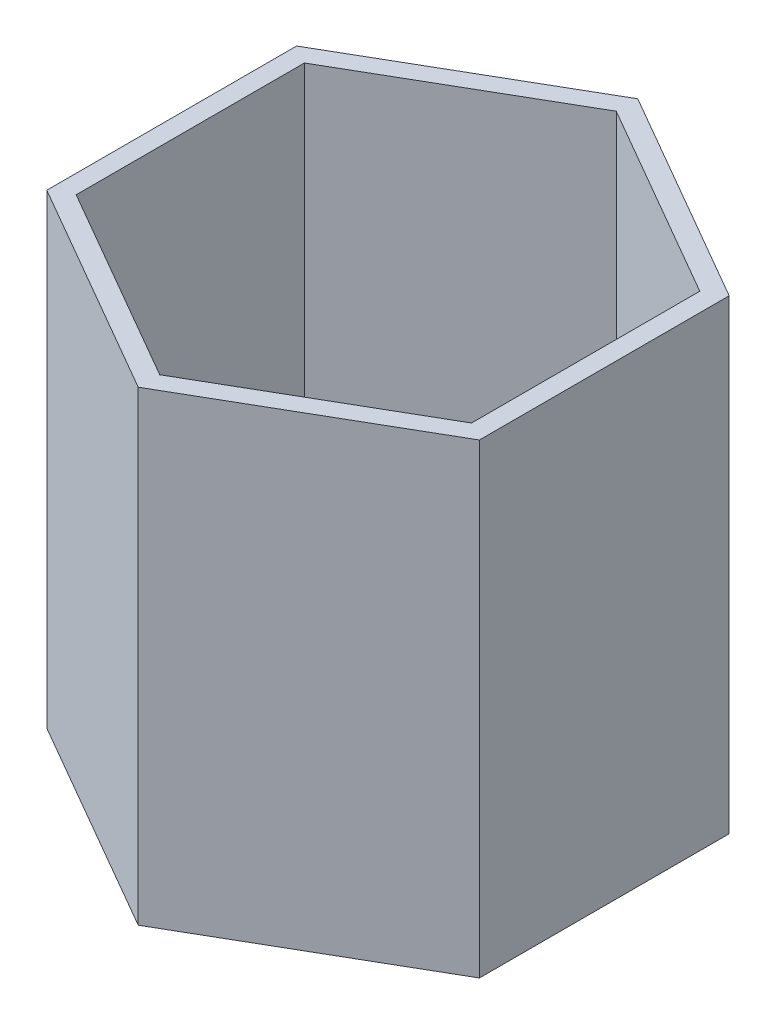
ISO-10303-21;
HEADER;
FILE_DESCRIPTION(('STEP AP214'),'2;1');
FILE_NAME('part.step','',(''),(''),'','','');
FILE_SCHEMA(('AUTOMOTIVE_DESIGN { 1 0 10303 214 1 1 1 1 }'));
ENDSEC;
DATA;
#1=APPLICATION_CONTEXT('core data for automotive mechanical design processes');
#2=APPLICATION_PROTOCOL_DEFINITION('international standard','automotive_design',2000,#1);
#3=PRODUCT_CONTEXT('',#1,'mechanical');
#4=PRODUCT('Part','Part','',(#3));
#5=PRODUCT_RELATED_PRODUCT_CATEGORY('part','',(#4));
#6=PRODUCT_DEFINITION_FORMATION('','',#4);
#7=PRODUCT_DEFINITION_CONTEXT('part definition',#1,'design');
#8=PRODUCT_DEFINITION('design','',#6,#7);
#9=PRODUCT_DEFINITION_SHAPE('','',#8);
#10=(LENGTH_UNIT() NAMED_UNIT(*) SI_UNIT(.MILLI.,.METRE.));
#11=(NAMED_UNIT(*) PLANE_ANGLE_UNIT() SI_UNIT($,.RADIAN.));
#12=(NAMED_UNIT(*) SI_UNIT($,.STERADIAN.) SOLID_ANGLE_UNIT());
#13=UNCERTAINTY_MEASURE_WITH_UNIT(LENGTH_MEASURE(1.E-05),#10,'distance_accuracy_value','');
#14=(GEOMETRIC_REPRESENTATION_CONTEXT(3) GLOBAL_UNCERTAINTY_ASSIGNED_CONTEXT((#13)) GLOBAL_UNIT_ASSIGNED_CONTEXT((#10,
#11,#12)) REPRESENTATION_CONTEXT('',''));
#15=CARTESIAN_POINT('',(0.,0.,0.));
#16=DIRECTION('',(0.,0.,1.));
#17=DIRECTION('',(1.,0.,0.));
#18=AXIS2_PLACEMENT_3D('',#15,#16,#17);
#19=CARTESIAN_POINT('',(23.2124666766494,3.,0.));
#20=DIRECTION('',(-1.,0.,0.));
#21=DIRECTION('',(0.,0.,1.));
#22=AXIS2_PLACEMENT_3D('',#19,#20,#21);
#23=PLANE('',#22);
#24=DIRECTION('',(0.,0.,-1.));
#25=VECTOR('',#24,1.);
#26=CARTESIAN_POINT('',(23.2124666766494,0.,0.));
#27=LINE('',#26,#25);
#28=CARTESIAN_POINT('',(23.2124666766494,0.,13.4017238843187));
#29=VERTEX_POINT('',#28);
#30=CARTESIAN_POINT('',(23.2124666766494,0.,-13.4017238843188));
#31=VERTEX_POINT('',#30);
#32=EDGE_CURVE('E200',#29,#31,#27,.T.);
#33=ORIENTED_EDGE('',*,*,#32,.T.);
#34=DIRECTION('',(0.,-1.,0.));
#35=VECTOR('',#34,1.);
#36=CARTESIAN_POINT('',(23.2124666766494,3.,-13.4017238843188));
#37=LINE('',#36,#35);
#38=CARTESIAN_POINT('',(23.2124666766494,50.,-13.4017238843188));
#39=VERTEX_POINT('',#38);
#40=EDGE_CURVE('E11',#39,#31,#37,.T.);
#41=ORIENTED_EDGE('',*,*,#40,.F.);
#42=DIRECTION('',(0.,0.,-1.));
#43=VECTOR('',#42,1.);
#44=CARTESIAN_POINT('',(23.2124666766494,50.,13.4017238843187));
#45=LINE('',#44,#43);
#46=CARTESIAN_POINT('',(23.2124666766494,50.,13.4017238843187));
#47=VERTEX_POINT('',#46);
#48=EDGE_CURVE('E184',#47,#39,#45,.T.);
#49=ORIENTED_EDGE('',*,*,#48,.F.);
#50=DIRECTION('',(0.,-1.,0.));
#51=VECTOR('',#50,1.);
#52=CARTESIAN_POINT('',(23.2124666766494,3.,13.4017238843187));
#53=LINE('',#52,#51);
#54=EDGE_CURVE('E213',#47,#29,#53,.T.);
#55=ORIENTED_EDGE('',*,*,#54,.T.);
#56=EDGE_LOOP('',(#33,#41,#49,#55));
#57=FACE_BOUND('',#56,.T.);
#58=ADVANCED_FACE('F40',(#57),#23,.F.);
#59=CARTESIAN_POINT('',(11.6062333383247,3.,-20.1025858264781));
#60=DIRECTION('',(-0.5,0.,0.866025403784439));
#61=DIRECTION('',(0.866025403784439,0.,0.5));
#62=AXIS2_PLACEMENT_3D('',#59,#60,#61);
#63=PLANE('',#62);
#64=DIRECTION('',(-0.866025403784439,0.,-0.5));
#65=VECTOR('',#64,1.);
#66=CARTESIAN_POINT('',(11.6062333383247,0.,-20.1025858264781));
#67=LINE('',#66,#65);
#68=CARTESIAN_POINT('',(0.,0.,-26.8034477686375));
#69=VERTEX_POINT('',#68);
#70=EDGE_CURVE('E203',#31,#69,#67,.T.);
#71=ORIENTED_EDGE('',*,*,#70,.T.);
#72=DIRECTION('',(0.,-1.,0.));
#73=VECTOR('',#72,1.);
#74=CARTESIAN_POINT('',(0.,3.,-26.8034477686375));
#75=LINE('',#74,#73);
#76=CARTESIAN_POINT('',(0.,50.,-26.8034477686375));
#77=VERTEX_POINT('',#76);
#78=EDGE_CURVE('E47',#77,#69,#75,.T.);
#79=ORIENTED_EDGE('',*,*,#78,.F.);
#80=DIRECTION('',(-0.866025403784439,0.,-0.5));
#81=VECTOR('',#80,1.);
#82=CARTESIAN_POINT('',(23.2124666766494,50.,-13.4017238843188));
#83=LINE('',#82,#81);
#84=EDGE_CURVE('E142',#39,#77,#83,.T.);
#85=ORIENTED_EDGE('',*,*,#84,.F.);
#86=ORIENTED_EDGE('',*,*,#40,.T.);
#87=EDGE_LOOP('',(#71,#79,#85,#86));
#88=FACE_BOUND('',#87,.T.);
#89=ADVANCED_FACE('F249',(#88),#63,.F.);
#90=CARTESIAN_POINT('',(-11.6062333383247,3.,-20.1025858264781));
#91=DIRECTION('',(0.5,0.,0.866025403784439));
#92=DIRECTION('',(0.866025403784439,0.,-0.5));
#93=AXIS2_PLACEMENT_3D('',#90,#91,#92);
#94=PLANE('',#93);
#95=DIRECTION('',(-0.866025403784439,0.,0.5));
#96=VECTOR('',#95,1.);
#97=CARTESIAN_POINT('',(-11.6062333383247,0.,-20.1025858264781));
#98=LINE('',#97,#96);
#99=CARTESIAN_POINT('',(-23.2124666766494,0.,-13.4017238843188));
#100=VERTEX_POINT('',#99);
#101=EDGE_CURVE('E205',#69,#100,#98,.T.);
#102=ORIENTED_EDGE('',*,*,#101,.T.);
#103=DIRECTION('',(0.,-1.,0.));
#104=VECTOR('',#103,1.);
#105=CARTESIAN_POINT('',(-23.2124666766494,3.,-13.4017238843188));
#106=LINE('',#105,#104);
#107=CARTESIAN_POINT('',(-23.2124666766494,50.,-13.4017238843188));
#108=VERTEX_POINT('',#107);
#109=EDGE_CURVE('E222',#108,#100,#106,.T.);
#110=ORIENTED_EDGE('',*,*,#109,.F.);
#111=DIRECTION('',(-0.866025403784438,0.,0.5));
#112=VECTOR('',#111,1.);
#113=CARTESIAN_POINT('',(0.,50.,-26.8034477686375));
#114=LINE('',#113,#112);
#115=EDGE_CURVE('E172',#77,#108,#114,.T.);
#116=ORIENTED_EDGE('',*,*,#115,.F.);
#117=ORIENTED_EDGE('',*,*,#78,.T.);
#118=EDGE_LOOP('',(#102,#110,#116,#117));
#119=FACE_BOUND('',#118,.T.);
#120=ADVANCED_FACE('F228',(#119),#94,.F.);
#121=CARTESIAN_POINT('',(-23.2124666766494,3.,0.));
#122=DIRECTION('',(1.,0.,0.));
#123=DIRECTION('',(0.,0.,-1.));
#124=AXIS2_PLACEMENT_3D('',#121,#122,#123);
#125=PLANE('',#124);
#126=DIRECTION('',(0.,0.,1.));
#127=VECTOR('',#126,1.);
#128=CARTESIAN_POINT('',(-23.2124666766494,0.,0.));
#129=LINE('',#128,#127);
#130=CARTESIAN_POINT('',(-23.2124666766494,0.,13.4017238843188));
#131=VERTEX_POINT('',#130);
#132=EDGE_CURVE('E207',#100,#131,#129,.T.);
#133=ORIENTED_EDGE('',*,*,#132,.T.);
#134=DIRECTION('',(0.,-1.,0.));
#135=VECTOR('',#134,1.);
#136=CARTESIAN_POINT('',(-23.2124666766494,3.,13.4017238843188));
#137=LINE('',#136,#135);
#138=CARTESIAN_POINT('',(-23.2124666766494,50.,13.4017238843188));
#139=VERTEX_POINT('',#138);
#140=EDGE_CURVE('E219',#139,#131,#137,.T.);
#141=ORIENTED_EDGE('',*,*,#140,.F.);
#142=DIRECTION('',(0.,0.,1.));
#143=VECTOR('',#142,1.);
#144=CARTESIAN_POINT('',(-23.2124666766494,50.,-13.4017238843188));
#145=LINE('',#144,#143);
#146=EDGE_CURVE('E175',#108,#139,#145,.T.);
#147=ORIENTED_EDGE('',*,*,#146,.F.);
#148=ORIENTED_EDGE('',*,*,#109,.T.);
#149=EDGE_LOOP('',(#133,#141,#147,#148));
#150=FACE_BOUND('',#149,.T.);
#151=ADVANCED_FACE('F238',(#150),#125,.F.);
#152=CARTESIAN_POINT('',(-11.6062333383247,3.,20.1025858264781));
#153=DIRECTION('',(0.5,0.,-0.866025403784439));
#154=DIRECTION('',(-0.866025403784439,0.,-0.5));
#155=AXIS2_PLACEMENT_3D('',#152,#153,#154);
#156=PLANE('',#155);
#157=DIRECTION('',(0.866025403784439,0.,0.5));
#158=VECTOR('',#157,1.);
#159=CARTESIAN_POINT('',(-11.6062333383247,0.,20.1025858264781));
#160=LINE('',#159,#158);
#161=CARTESIAN_POINT('',(0.,0.,26.8034477686375));
#162=VERTEX_POINT('',#161);
#163=EDGE_CURVE('E209',#131,#162,#160,.T.);
#164=ORIENTED_EDGE('',*,*,#163,.T.);
#165=DIRECTION('',(0.,-1.,0.));
#166=VECTOR('',#165,1.);
#167=CARTESIAN_POINT('',(0.,3.,26.8034477686375));
#168=LINE('',#167,#166);
#169=CARTESIAN_POINT('',(0.,50.,26.8034477686375));
#170=VERTEX_POINT('',#169);
#171=EDGE_CURVE('E216',#170,#162,#168,.T.);
#172=ORIENTED_EDGE('',*,*,#171,.F.);
#173=DIRECTION('',(0.866025403784439,0.,0.5));
#174=VECTOR('',#173,1.);
#175=CARTESIAN_POINT('',(-23.2124666766494,50.,13.4017238843188));
#176=LINE('',#175,#174);
#177=EDGE_CURVE('E178',#139,#170,#176,.T.);
#178=ORIENTED_EDGE('',*,*,#177,.F.);
#179=ORIENTED_EDGE('',*,*,#140,.T.);
#180=EDGE_LOOP('',(#164,#172,#178,#179));
#181=FACE_BOUND('',#180,.T.);
#182=ADVANCED_FACE('F242',(#181),#156,.F.);
#183=CARTESIAN_POINT('',(11.6062333383247,3.,20.1025858264781));
#184=DIRECTION('',(-0.5,0.,-0.866025403784438));
#185=DIRECTION('',(-0.866025403784439,0.,0.5));
#186=AXIS2_PLACEMENT_3D('',#183,#184,#185);
#187=PLANE('',#186);
#188=DIRECTION('',(0.866025403784439,0.,-0.5));
#189=VECTOR('',#188,1.);
#190=CARTESIAN_POINT('',(11.6062333383247,0.,20.1025858264781));
#191=LINE('',#190,#189);
#192=EDGE_CURVE('E211',#162,#29,#191,.T.);
#193=ORIENTED_EDGE('',*,*,#192,.T.);
#194=ORIENTED_EDGE('',*,*,#54,.F.);
#195=DIRECTION('',(0.866025403784438,0.,-0.5));
#196=VECTOR('',#195,1.);
#197=CARTESIAN_POINT('',(0.,50.,26.8034477686375));
#198=LINE('',#197,#196);
#199=EDGE_CURVE('E181',#170,#47,#198,.T.);
#200=ORIENTED_EDGE('',*,*,#199,.F.);
#201=ORIENTED_EDGE('',*,*,#171,.T.);
#202=EDGE_LOOP('',(#193,#194,#200,#201));
#203=FACE_BOUND('',#202,.T.);
#204=ADVANCED_FACE('F247',(#203),#187,.F.);
#205=CARTESIAN_POINT('',(0.,0.,0.));
#206=DIRECTION('',(0.,1.,0.));
#207=DIRECTION('',(0.,0.,1.));
#208=AXIS2_PLACEMENT_3D('',#205,#206,#207);
#209=PLANE('',#208);
#210=ORIENTED_EDGE('',*,*,#32,.F.);
#211=ORIENTED_EDGE('',*,*,#192,.F.);
#212=ORIENTED_EDGE('',*,*,#163,.F.);
#213=ORIENTED_EDGE('',*,*,#132,.F.);
#214=ORIENTED_EDGE('',*,*,#101,.F.);
#215=ORIENTED_EDGE('',*,*,#70,.F.);
#216=EDGE_LOOP('',(#210,#211,#212,#213,#214,#215));
#217=FACE_BOUND('',#216,.T.);
#218=ADVANCED_FACE('F234',(#217),#209,.F.);
#219=CARTESIAN_POINT('',(0.,50.,0.));
#220=DIRECTION('',(0.,1.,0.));
#221=DIRECTION('',(0.,0.,1.));
#222=AXIS2_PLACEMENT_3D('',#219,#220,#221);
#223=PLANE('',#222);
#224=ORIENTED_EDGE('',*,*,#84,.T.);
#225=ORIENTED_EDGE('',*,*,#115,.T.);
#226=ORIENTED_EDGE('',*,*,#146,.T.);
#227=ORIENTED_EDGE('',*,*,#177,.T.);
#228=ORIENTED_EDGE('',*,*,#199,.T.);
#229=ORIENTED_EDGE('',*,*,#48,.T.);
#230=EDGE_LOOP('',(#224,#225,#226,#227,#228,#229));
#231=FACE_BOUND('',#230,.T.);
#232=DIRECTION('',(-0.866025403784439,0.,-0.5));
#233=VECTOR('',#232,1.);
#234=CARTESIAN_POINT('',(21.2124666766494,50.,-12.2470233459395));
#235=LINE('',#234,#233);
#236=CARTESIAN_POINT('',(21.2124666766494,50.,-12.2470233459395));
#237=VERTEX_POINT('',#236);
#238=CARTESIAN_POINT('',(0.,50.,-24.494046691879));
#239=VERTEX_POINT('',#238);
#240=EDGE_CURVE('E136',#237,#239,#235,.T.);
#241=ORIENTED_EDGE('',*,*,#240,.F.);
#242=DIRECTION('',(0.,0.,-1.));
#243=VECTOR('',#242,1.);
#244=CARTESIAN_POINT('',(21.2124666766494,50.,12.2470233459395));
#245=LINE('',#244,#243);
#246=CARTESIAN_POINT('',(21.2124666766494,50.,12.2470233459395));
#247=VERTEX_POINT('',#246);
#248=EDGE_CURVE('E127',#247,#237,#245,.T.);
#249=ORIENTED_EDGE('',*,*,#248,.F.);
#250=DIRECTION('',(0.866025403784439,0.,-0.5));
#251=VECTOR('',#250,1.);
#252=CARTESIAN_POINT('',(0.,50.,24.494046691879));
#253=LINE('',#252,#251);
#254=CARTESIAN_POINT('',(0.,50.,24.494046691879));
#255=VERTEX_POINT('',#254);
#256=EDGE_CURVE('E157',#255,#247,#253,.T.);
#257=ORIENTED_EDGE('',*,*,#256,.F.);
#258=DIRECTION('',(0.866025403784439,0.,0.5));
#259=VECTOR('',#258,1.);
#260=CARTESIAN_POINT('',(-21.2124666766494,50.,12.2470233459395));
#261=LINE('',#260,#259);
#262=CARTESIAN_POINT('',(-21.2124666766494,50.,12.2470233459395));
#263=VERTEX_POINT('',#262);
#264=EDGE_CURVE('E154',#263,#255,#261,.T.);
#265=ORIENTED_EDGE('',*,*,#264,.F.);
#266=DIRECTION('',(0.,0.,1.));
#267=VECTOR('',#266,1.);
#268=CARTESIAN_POINT('',(-21.2124666766494,50.,-12.2470233459395));
#269=LINE('',#268,#267);
#270=CARTESIAN_POINT('',(-21.2124666766494,50.,-12.2470233459395));
#271=VERTEX_POINT('',#270);
#272=EDGE_CURVE('E150',#271,#263,#269,.T.);
#273=ORIENTED_EDGE('',*,*,#272,.F.);
#274=DIRECTION('',(-0.866025403784439,0.,0.5));
#275=VECTOR('',#274,1.);
#276=CARTESIAN_POINT('',(0.,50.,-24.494046691879));
#277=LINE('',#276,#275);
#278=EDGE_CURVE('E148',#239,#271,#277,.T.);
#279=ORIENTED_EDGE('',*,*,#278,.F.);
#280=EDGE_LOOP('',(#241,#249,#257,#265,#273,#279));
#281=FACE_BOUND('',#280,.T.);
#282=ADVANCED_FACE('F146',(#231,#281),#223,.T.);
#283=CARTESIAN_POINT('',(21.2124666766494,50.,12.2470233459395));
#284=DIRECTION('',(-1.,0.,0.));
#285=DIRECTION('',(0.,0.,1.));
#286=AXIS2_PLACEMENT_3D('',#283,#284,#285);
#287=PLANE('',#286);
#288=DIRECTION('',(0.,-1.,0.));
#289=VECTOR('',#288,1.);
#290=CARTESIAN_POINT('',(21.2124666766494,50.,-12.2470233459395));
#291=LINE('',#290,#289);
#292=CARTESIAN_POINT('',(21.2124666766494,3.,-12.2470233459395));
#293=VERTEX_POINT('',#292);
#294=EDGE_CURVE('E130',#237,#293,#291,.T.);
#295=ORIENTED_EDGE('',*,*,#294,.T.);
#296=DIRECTION('',(0.,0.,1.));
#297=VECTOR('',#296,1.);
#298=CARTESIAN_POINT('',(21.2124666766494,3.,0.));
#299=LINE('',#298,#297);
#300=CARTESIAN_POINT('',(21.2124666766494,3.,12.2470233459395));
#301=VERTEX_POINT('',#300);
#302=EDGE_CURVE('E54',#293,#301,#299,.T.);
#303=ORIENTED_EDGE('',*,*,#302,.T.);
#304=DIRECTION('',(0.,-1.,0.));
#305=VECTOR('',#304,1.);
#306=CARTESIAN_POINT('',(21.2124666766494,50.,12.2470233459395));
#307=LINE('',#306,#305);
#308=EDGE_CURVE('E132',#247,#301,#307,.T.);
#309=ORIENTED_EDGE('',*,*,#308,.F.);
#310=ORIENTED_EDGE('',*,*,#248,.T.);
#311=EDGE_LOOP('',(#295,#303,#309,#310));
#312=FACE_BOUND('',#311,.T.);
#313=ADVANCED_FACE('F129',(#312),#287,.T.);
#314=CARTESIAN_POINT('',(21.2124666766494,50.,-12.2470233459395));
#315=DIRECTION('',(-0.5,0.,0.866025403784439));
#316=DIRECTION('',(0.866025403784439,0.,0.5));
#317=AXIS2_PLACEMENT_3D('',#314,#315,#316);
#318=PLANE('',#317);
#319=DIRECTION('',(0.,-1.,0.));
#320=VECTOR('',#319,1.);
#321=CARTESIAN_POINT('',(0.,50.,-24.494046691879));
#322=LINE('',#321,#320);
#323=CARTESIAN_POINT('',(0.,3.,-24.494046691879));
#324=VERTEX_POINT('',#323);
#325=EDGE_CURVE('E143',#239,#324,#322,.T.);
#326=ORIENTED_EDGE('',*,*,#325,.T.);
#327=DIRECTION('',(0.866025403784439,0.,0.5));
#328=VECTOR('',#327,1.);
#329=CARTESIAN_POINT('',(10.6062333383247,3.,-18.3705350189093));
#330=LINE('',#329,#328);
#331=EDGE_CURVE('E58',#324,#293,#330,.T.);
#332=ORIENTED_EDGE('',*,*,#331,.T.);
#333=ORIENTED_EDGE('',*,*,#294,.F.);
#334=ORIENTED_EDGE('',*,*,#240,.T.);
#335=EDGE_LOOP('',(#326,#332,#333,#334));
#336=FACE_BOUND('',#335,.T.);
#337=ADVANCED_FACE('F140',(#336),#318,.T.);
#338=CARTESIAN_POINT('',(0.,50.,-24.494046691879));
#339=DIRECTION('',(0.5,0.,0.866025403784438));
#340=DIRECTION('',(0.866025403784438,0.,-0.5));
#341=AXIS2_PLACEMENT_3D('',#338,#339,#340);
#342=PLANE('',#341);
#343=DIRECTION('',(0.,-1.,0.));
#344=VECTOR('',#343,1.);
#345=CARTESIAN_POINT('',(-21.2124666766494,50.,-12.2470233459395));
#346=LINE('',#345,#344);
#347=CARTESIAN_POINT('',(-21.2124666766494,3.,-12.2470233459395));
#348=VERTEX_POINT('',#347);
#349=EDGE_CURVE('E166',#271,#348,#346,.T.);
#350=ORIENTED_EDGE('',*,*,#349,.T.);
#351=DIRECTION('',(0.866025403784438,0.,-0.5));
#352=VECTOR('',#351,1.);
#353=CARTESIAN_POINT('',(-10.6062333383247,3.,-18.3705350189092));
#354=LINE('',#353,#352);
#355=EDGE_CURVE('E196',#348,#324,#354,.T.);
#356=ORIENTED_EDGE('',*,*,#355,.T.);
#357=ORIENTED_EDGE('',*,*,#325,.F.);
#358=ORIENTED_EDGE('',*,*,#278,.T.);
#359=EDGE_LOOP('',(#350,#356,#357,#358));
#360=FACE_BOUND('',#359,.T.);
#361=ADVANCED_FACE('F275',(#360),#342,.T.);
#362=CARTESIAN_POINT('',(-21.2124666766494,50.,-12.2470233459395));
#363=DIRECTION('',(1.,0.,0.));
#364=DIRECTION('',(0.,0.,-1.));
#365=AXIS2_PLACEMENT_3D('',#362,#363,#364);
#366=PLANE('',#365);
#367=DIRECTION('',(0.,-1.,0.));
#368=VECTOR('',#367,1.);
#369=CARTESIAN_POINT('',(-21.2124666766494,50.,12.2470233459395));
#370=LINE('',#369,#368);
#371=CARTESIAN_POINT('',(-21.2124666766494,3.,12.2470233459395));
#372=VERTEX_POINT('',#371);
#373=EDGE_CURVE('E163',#263,#372,#370,.T.);
#374=ORIENTED_EDGE('',*,*,#373,.T.);
#375=DIRECTION('',(0.,0.,-1.));
#376=VECTOR('',#375,1.);
#377=CARTESIAN_POINT('',(-21.2124666766494,3.,0.));
#378=LINE('',#377,#376);
#379=EDGE_CURVE('E193',#372,#348,#378,.T.);
#380=ORIENTED_EDGE('',*,*,#379,.T.);
#381=ORIENTED_EDGE('',*,*,#349,.F.);
#382=ORIENTED_EDGE('',*,*,#272,.T.);
#383=EDGE_LOOP('',(#374,#380,#381,#382));
#384=FACE_BOUND('',#383,.T.);
#385=ADVANCED_FACE('F278',(#384),#366,.T.);
#386=CARTESIAN_POINT('',(-21.2124666766494,50.,12.2470233459395));
#387=DIRECTION('',(0.5,0.,-0.866025403784439));
#388=DIRECTION('',(-0.866025403784439,0.,-0.5));
#389=AXIS2_PLACEMENT_3D('',#386,#387,#388);
#390=PLANE('',#389);
#391=DIRECTION('',(0.,-1.,0.));
#392=VECTOR('',#391,1.);
#393=CARTESIAN_POINT('',(0.,50.,24.494046691879));
#394=LINE('',#393,#392);
#395=CARTESIAN_POINT('',(0.,3.,24.494046691879));
#396=VERTEX_POINT('',#395);
#397=EDGE_CURVE('E160',#255,#396,#394,.T.);
#398=ORIENTED_EDGE('',*,*,#397,.T.);
#399=DIRECTION('',(-0.866025403784439,0.,-0.5));
#400=VECTOR('',#399,1.);
#401=CARTESIAN_POINT('',(-10.6062333383247,3.,18.3705350189093));
#402=LINE('',#401,#400);
#403=EDGE_CURVE('E190',#396,#372,#402,.T.);
#404=ORIENTED_EDGE('',*,*,#403,.T.);
#405=ORIENTED_EDGE('',*,*,#373,.F.);
#406=ORIENTED_EDGE('',*,*,#264,.T.);
#407=EDGE_LOOP('',(#398,#404,#405,#406));
#408=FACE_BOUND('',#407,.T.);
#409=ADVANCED_FACE('F282',(#408),#390,.T.);
#410=CARTESIAN_POINT('',(0.,50.,24.494046691879));
#411=DIRECTION('',(-0.5,0.,-0.866025403784439));
#412=DIRECTION('',(-0.866025403784439,0.,0.5));
#413=AXIS2_PLACEMENT_3D('',#410,#411,#412);
#414=PLANE('',#413);
#415=ORIENTED_EDGE('',*,*,#308,.T.);
#416=DIRECTION('',(-0.866025403784439,0.,0.5));
#417=VECTOR('',#416,1.);
#418=CARTESIAN_POINT('',(10.6062333383247,3.,18.3705350189092));
#419=LINE('',#418,#417);
#420=EDGE_CURVE('E187',#301,#396,#419,.T.);
#421=ORIENTED_EDGE('',*,*,#420,.T.);
#422=ORIENTED_EDGE('',*,*,#397,.F.);
#423=ORIENTED_EDGE('',*,*,#256,.T.);
#424=EDGE_LOOP('',(#415,#421,#422,#423));
#425=FACE_BOUND('',#424,.T.);
#426=ADVANCED_FACE('F268',(#425),#414,.T.);
#427=CARTESIAN_POINT('',(0.,3.,0.));
#428=DIRECTION('',(0.,1.,0.));
#429=DIRECTION('',(0.,0.,1.));
#430=AXIS2_PLACEMENT_3D('',#427,#428,#429);
#431=PLANE('',#430);
#432=ORIENTED_EDGE('',*,*,#302,.F.);
#433=ORIENTED_EDGE('',*,*,#331,.F.);
#434=ORIENTED_EDGE('',*,*,#355,.F.);
#435=ORIENTED_EDGE('',*,*,#379,.F.);
#436=ORIENTED_EDGE('',*,*,#403,.F.);
#437=ORIENTED_EDGE('',*,*,#420,.F.);
#438=EDGE_LOOP('',(#432,#433,#434,#435,#436,#437));
#439=FACE_BOUND('',#438,.T.);
#440=ADVANCED_FACE('F265',(#439),#431,.T.);
#441=CLOSED_SHELL('',(#58,#89,#120,#151,#182,#204,#218,#282,#313,#337,#361,#385,#409,#426,#440));
#442=MANIFOLD_SOLID_BREP('B2',#441);
#443=ADVANCED_BREP_SHAPE_REPRESENTATION('',(#18,#442),#14);
#444=SHAPE_DEFINITION_REPRESENTATION(#9,#443);
ENDSEC;
END-ISO-10303-21;
